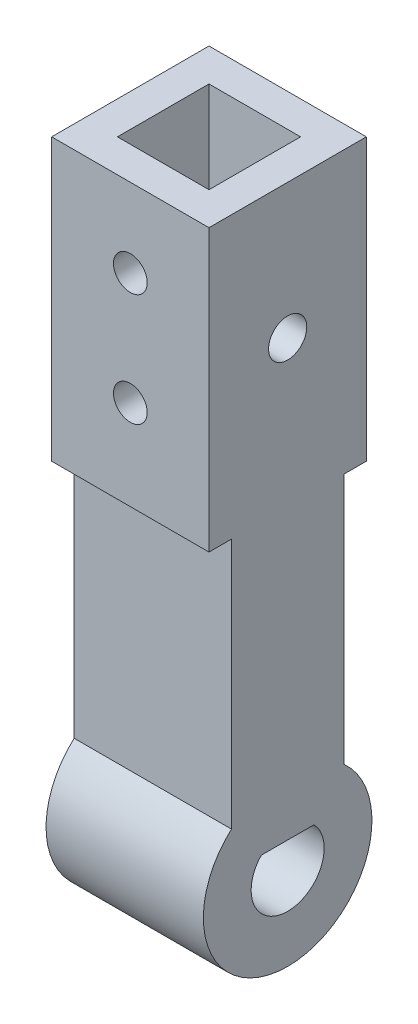
ISO-10303-21;
HEADER;
FILE_DESCRIPTION(('STEP AP214'),'2;1');
FILE_NAME('part.step','',(''),(''),'','','');
FILE_SCHEMA(('AUTOMOTIVE_DESIGN { 1 0 10303 214 1 1 1 1 }'));
ENDSEC;
DATA;
#1=APPLICATION_CONTEXT('core data for automotive mechanical design processes');
#2=APPLICATION_PROTOCOL_DEFINITION('international standard','automotive_design',2000,#1);
#3=PRODUCT_CONTEXT('',#1,'mechanical');
#4=PRODUCT('Part','Part','',(#3));
#5=PRODUCT_RELATED_PRODUCT_CATEGORY('part','',(#4));
#6=PRODUCT_DEFINITION_FORMATION('','',#4);
#7=PRODUCT_DEFINITION_CONTEXT('part definition',#1,'design');
#8=PRODUCT_DEFINITION('design','',#6,#7);
#9=PRODUCT_DEFINITION_SHAPE('','',#8);
#10=(LENGTH_UNIT() NAMED_UNIT(*) SI_UNIT(.MILLI.,.METRE.));
#11=(NAMED_UNIT(*) PLANE_ANGLE_UNIT() SI_UNIT($,.RADIAN.));
#12=(NAMED_UNIT(*) SI_UNIT($,.STERADIAN.) SOLID_ANGLE_UNIT());
#13=UNCERTAINTY_MEASURE_WITH_UNIT(LENGTH_MEASURE(1.E-05),#10,'distance_accuracy_value','');
#14=(GEOMETRIC_REPRESENTATION_CONTEXT(3) GLOBAL_UNCERTAINTY_ASSIGNED_CONTEXT((#13)) GLOBAL_UNIT_ASSIGNED_CONTEXT((#10,
#11,#12)) REPRESENTATION_CONTEXT('',''));
#15=CARTESIAN_POINT('',(0.,0.,0.));
#16=DIRECTION('',(0.,0.,1.));
#17=DIRECTION('',(1.,0.,0.));
#18=AXIS2_PLACEMENT_3D('',#15,#16,#17);
#19=CARTESIAN_POINT('',(0.,27.9408578006437,0.));
#20=DIRECTION('',(0.,1.,0.));
#21=DIRECTION('',(0.,0.,1.));
#22=AXIS2_PLACEMENT_3D('',#19,#20,#21);
#23=PLANE('',#22);
#24=DIRECTION('',(0.,0.,1.));
#25=VECTOR('',#24,1.);
#26=CARTESIAN_POINT('',(61.,27.9408578006437,-2.));
#27=LINE('',#26,#25);
#28=CARTESIAN_POINT('',(61.,27.9408578006437,10.));
#29=VERTEX_POINT('',#28);
#30=CARTESIAN_POINT('',(61.,27.9408578006437,12.));
#31=VERTEX_POINT('',#30);
#32=EDGE_CURVE('E256',#29,#31,#27,.T.);
#33=ORIENTED_EDGE('',*,*,#32,.F.);
#34=DIRECTION('',(1.,0.,0.));
#35=VECTOR('',#34,1.);
#36=CARTESIAN_POINT('',(65.,27.9408578006437,10.));
#37=LINE('',#36,#35);
#38=CARTESIAN_POINT('',(75.,27.9408578006437,10.));
#39=VERTEX_POINT('',#38);
#40=EDGE_CURVE('E59',#29,#39,#37,.T.);
#41=ORIENTED_EDGE('',*,*,#40,.T.);
#42=DIRECTION('',(0.,0.,-1.));
#43=VECTOR('',#42,1.);
#44=CARTESIAN_POINT('',(75.,27.9408578006437,-2.));
#45=LINE('',#44,#43);
#46=CARTESIAN_POINT('',(75.,27.9408578006437,12.));
#47=VERTEX_POINT('',#46);
#48=EDGE_CURVE('E289',#47,#39,#45,.T.);
#49=ORIENTED_EDGE('',*,*,#48,.F.);
#50=DIRECTION('',(1.,0.,0.));
#51=VECTOR('',#50,1.);
#52=CARTESIAN_POINT('',(61.,27.9408578006437,12.));
#53=LINE('',#52,#51);
#54=EDGE_CURVE('E285',#31,#47,#53,.T.);
#55=ORIENTED_EDGE('',*,*,#54,.F.);
#56=EDGE_LOOP('',(#33,#41,#49,#55));
#57=FACE_BOUND('',#56,.T.);
#58=ADVANCED_FACE('F41',(#57),#23,.F.);
#59=DIRECTION('',(-1.,0.,0.));
#60=VECTOR('',#59,1.);
#61=CARTESIAN_POINT('',(0.,27.9408578006437,0.));
#62=LINE('',#61,#60);
#63=CARTESIAN_POINT('',(75.,27.9408578006437,0.));
#64=VERTEX_POINT('',#63);
#65=CARTESIAN_POINT('',(61.,27.9408578006437,0.));
#66=VERTEX_POINT('',#65);
#67=EDGE_CURVE('E312',#64,#66,#62,.T.);
#68=ORIENTED_EDGE('',*,*,#67,.T.);
#69=CARTESIAN_POINT('',(61.,27.9408578006437,-2.));
#70=VERTEX_POINT('',#69);
#71=EDGE_CURVE('E281',#70,#66,#27,.T.);
#72=ORIENTED_EDGE('',*,*,#71,.F.);
#73=DIRECTION('',(-1.,0.,0.));
#74=VECTOR('',#73,1.);
#75=CARTESIAN_POINT('',(61.,27.9408578006437,-2.));
#76=LINE('',#75,#74);
#77=CARTESIAN_POINT('',(75.,27.9408578006437,-2.));
#78=VERTEX_POINT('',#77);
#79=EDGE_CURVE('E271',#78,#70,#76,.T.);
#80=ORIENTED_EDGE('',*,*,#79,.F.);
#81=EDGE_CURVE('E288',#64,#78,#45,.T.);
#82=ORIENTED_EDGE('',*,*,#81,.F.);
#83=EDGE_LOOP('',(#68,#72,#80,#82));
#84=FACE_BOUND('',#83,.T.);
#85=ADVANCED_FACE('F354',(#84),#23,.F.);
#86=CARTESIAN_POINT('',(0.,0.,0.));
#87=DIRECTION('',(0.,0.,-1.));
#88=DIRECTION('',(-1.,0.,0.));
#89=AXIS2_PLACEMENT_3D('',#86,#87,#88);
#90=PLANE('',#89);
#91=ORIENTED_EDGE('',*,*,#67,.F.);
#92=DIRECTION('',(0.,1.,0.));
#93=VECTOR('',#92,1.);
#94=CARTESIAN_POINT('',(75.,121.945008564838,0.));
#95=LINE('',#94,#93);
#96=CARTESIAN_POINT('',(75.,5.59016994374946,0.));
#97=VERTEX_POINT('',#96);
#98=EDGE_CURVE('E323',#97,#64,#95,.T.);
#99=ORIENTED_EDGE('',*,*,#98,.F.);
#100=DIRECTION('',(-1.,0.,0.));
#101=VECTOR('',#100,1.);
#102=CARTESIAN_POINT('',(96.2132034355964,5.59016994374946,0.));
#103=LINE('',#102,#101);
#104=CARTESIAN_POINT('',(61.,5.59016994374946,0.));
#105=VERTEX_POINT('',#104);
#106=EDGE_CURVE('E319',#105,#97,#103,.F.);
#107=ORIENTED_EDGE('',*,*,#106,.F.);
#108=DIRECTION('',(0.,-1.,0.));
#109=VECTOR('',#108,1.);
#110=CARTESIAN_POINT('',(61.,27.9408578006437,0.));
#111=LINE('',#110,#109);
#112=EDGE_CURVE('E173',#66,#105,#111,.T.);
#113=ORIENTED_EDGE('',*,*,#112,.F.);
#114=EDGE_LOOP('',(#91,#99,#107,#113));
#115=FACE_BOUND('',#114,.T.);
#116=ADVANCED_FACE('F360',(#115),#90,.T.);
#117=CARTESIAN_POINT('',(75.,121.945008564838,10.));
#118=DIRECTION('',(-1.,0.,0.));
#119=DIRECTION('',(0.,-1.,0.));
#120=AXIS2_PLACEMENT_3D('',#117,#118,#119);
#121=PLANE('',#120);
#122=CARTESIAN_POINT('',(75.,40.9408578006437,5.));
#123=DIRECTION('',(1.,0.,0.));
#124=DIRECTION('',(0.,0.,-1.));
#125=AXIS2_PLACEMENT_3D('',#122,#123,#124);
#126=CIRCLE('',#125,1.69999999999999);
#127=CARTESIAN_POINT('',(75.,40.9408578006437,3.30000000000001));
#128=VERTEX_POINT('',#127);
#129=EDGE_CURVE('E177',#128,#128,#126,.T.);
#130=ORIENTED_EDGE('',*,*,#129,.F.);
#131=EDGE_LOOP('',(#130));
#132=FACE_BOUND('',#131,.T.);
#133=DIRECTION('',(0.,0.,-1.));
#134=VECTOR('',#133,1.);
#135=CARTESIAN_POINT('',(75.,2.24999999999999,10.));
#136=LINE('',#135,#134);
#137=CARTESIAN_POINT('',(75.,2.24999999999998,7.34520787991172));
#138=VERTEX_POINT('',#137);
#139=CARTESIAN_POINT('',(75.,2.24999999999999,2.65479212008828));
#140=VERTEX_POINT('',#139);
#141=EDGE_CURVE('E154',#138,#140,#136,.T.);
#142=ORIENTED_EDGE('',*,*,#141,.T.);
#143=CARTESIAN_POINT('',(75.,0.,5.));
#144=DIRECTION('',(-1.,0.,0.));
#145=DIRECTION('',(0.,-1.,0.));
#146=AXIS2_PLACEMENT_3D('',#143,#144,#145);
#147=CIRCLE('',#146,3.25);
#148=EDGE_CURVE('E151',#140,#138,#147,.T.);
#149=ORIENTED_EDGE('',*,*,#148,.T.);
#150=EDGE_LOOP('',(#142,#149));
#151=FACE_BOUND('',#150,.T.);
#152=ORIENTED_EDGE('',*,*,#98,.T.);
#153=ORIENTED_EDGE('',*,*,#81,.T.);
#154=DIRECTION('',(0.,-1.,0.));
#155=VECTOR('',#154,1.);
#156=CARTESIAN_POINT('',(75.,52.9408578006437,-2.));
#157=LINE('',#156,#155);
#158=CARTESIAN_POINT('',(75.,52.9408578006437,-2.));
#159=VERTEX_POINT('',#158);
#160=EDGE_CURVE('E298',#159,#78,#157,.T.);
#161=ORIENTED_EDGE('',*,*,#160,.F.);
#162=DIRECTION('',(0.,0.,-1.));
#163=VECTOR('',#162,1.);
#164=CARTESIAN_POINT('',(75.,52.9408578006437,-2.));
#165=LINE('',#164,#163);
#166=CARTESIAN_POINT('',(75.,52.9408578006437,12.));
#167=VERTEX_POINT('',#166);
#168=EDGE_CURVE('E274',#167,#159,#165,.T.);
#169=ORIENTED_EDGE('',*,*,#168,.F.);
#170=DIRECTION('',(0.,-1.,0.));
#171=VECTOR('',#170,1.);
#172=CARTESIAN_POINT('',(75.,52.9408578006437,12.));
#173=LINE('',#172,#171);
#174=EDGE_CURVE('E302',#167,#47,#173,.T.);
#175=ORIENTED_EDGE('',*,*,#174,.T.);
#176=ORIENTED_EDGE('',*,*,#48,.T.);
#177=DIRECTION('',(0.,1.,0.));
#178=VECTOR('',#177,1.);
#179=CARTESIAN_POINT('',(75.,121.945008564838,10.));
#180=LINE('',#179,#178);
#181=CARTESIAN_POINT('',(75.,5.59016994374946,10.));
#182=VERTEX_POINT('',#181);
#183=EDGE_CURVE('E51',#182,#39,#180,.T.);
#184=ORIENTED_EDGE('',*,*,#183,.F.);
#185=CARTESIAN_POINT('',(75.,0.,5.));
#186=DIRECTION('',(-1.,0.,0.));
#187=DIRECTION('',(0.,-1.,0.));
#188=AXIS2_PLACEMENT_3D('',#185,#186,#187);
#189=CIRCLE('',#188,7.5);
#190=EDGE_CURVE('E315',#182,#97,#189,.F.);
#191=ORIENTED_EDGE('',*,*,#190,.T.);
#192=EDGE_LOOP('',(#152,#153,#161,#169,#175,#176,#184,#191));
#193=FACE_BOUND('',#192,.T.);
#194=ADVANCED_FACE('F43',(#132,#151,#193),#121,.F.);
#195=CARTESIAN_POINT('',(0.,0.,10.));
#196=DIRECTION('',(0.,0.,-1.));
#197=DIRECTION('',(-1.,0.,0.));
#198=AXIS2_PLACEMENT_3D('',#195,#196,#197);
#199=PLANE('',#198);
#200=ORIENTED_EDGE('',*,*,#183,.T.);
#201=ORIENTED_EDGE('',*,*,#40,.F.);
#202=DIRECTION('',(0.,1.,0.));
#203=VECTOR('',#202,1.);
#204=CARTESIAN_POINT('',(61.,5.59016994374946,10.));
#205=LINE('',#204,#203);
#206=CARTESIAN_POINT('',(61.,5.59016994374946,10.));
#207=VERTEX_POINT('',#206);
#208=EDGE_CURVE('E170',#207,#29,#205,.T.);
#209=ORIENTED_EDGE('',*,*,#208,.F.);
#210=DIRECTION('',(-1.,0.,0.));
#211=VECTOR('',#210,1.);
#212=CARTESIAN_POINT('',(96.2132034355964,5.59016994374946,10.));
#213=LINE('',#212,#211);
#214=EDGE_CURVE('E11',#207,#182,#213,.F.);
#215=ORIENTED_EDGE('',*,*,#214,.T.);
#216=EDGE_LOOP('',(#200,#201,#209,#215));
#217=FACE_BOUND('',#216,.T.);
#218=ADVANCED_FACE('F381',(#217),#199,.F.);
#219=CARTESIAN_POINT('',(96.2132034355964,0.,5.));
#220=DIRECTION('',(-1.,0.,0.));
#221=DIRECTION('',(0.,0.,1.));
#222=AXIS2_PLACEMENT_3D('',#219,#220,#221);
#223=CYLINDRICAL_SURFACE('',#222,7.5);
#224=ORIENTED_EDGE('',*,*,#214,.F.);
#225=CARTESIAN_POINT('',(61.,0.,5.));
#226=DIRECTION('',(-1.,0.,0.));
#227=DIRECTION('',(0.,-1.,0.));
#228=AXIS2_PLACEMENT_3D('',#225,#226,#227);
#229=CIRCLE('',#228,7.5);
#230=EDGE_CURVE('E161',#105,#207,#229,.T.);
#231=ORIENTED_EDGE('',*,*,#230,.F.);
#232=ORIENTED_EDGE('',*,*,#106,.T.);
#233=ORIENTED_EDGE('',*,*,#190,.F.);
#234=EDGE_LOOP('',(#224,#231,#232,#233));
#235=FACE_BOUND('',#234,.T.);
#236=ADVANCED_FACE('F377',(#235),#223,.T.);
#237=CARTESIAN_POINT('',(61.,52.9408578006437,-2.));
#238=DIRECTION('',(1.,0.,0.));
#239=DIRECTION('',(0.,0.,-1.));
#240=AXIS2_PLACEMENT_3D('',#237,#238,#239);
#241=PLANE('',#240);
#242=CARTESIAN_POINT('',(61.,40.9408578006437,5.));
#243=DIRECTION('',(-1.,0.,0.));
#244=DIRECTION('',(0.,0.,1.));
#245=AXIS2_PLACEMENT_3D('',#242,#243,#244);
#246=CIRCLE('',#245,1.5);
#247=CARTESIAN_POINT('',(61.,40.9408578006437,6.5));
#248=VERTEX_POINT('',#247);
#249=EDGE_CURVE('E213',#248,#248,#246,.T.);
#250=ORIENTED_EDGE('',*,*,#249,.F.);
#251=EDGE_LOOP('',(#250));
#252=FACE_BOUND('',#251,.T.);
#253=ORIENTED_EDGE('',*,*,#71,.T.);
#254=ORIENTED_EDGE('',*,*,#112,.T.);
#255=ORIENTED_EDGE('',*,*,#230,.T.);
#256=ORIENTED_EDGE('',*,*,#208,.T.);
#257=ORIENTED_EDGE('',*,*,#32,.T.);
#258=DIRECTION('',(0.,-1.,0.));
#259=VECTOR('',#258,1.);
#260=CARTESIAN_POINT('',(61.,52.9408578006437,12.));
#261=LINE('',#260,#259);
#262=CARTESIAN_POINT('',(61.,52.9408578006437,12.));
#263=VERTEX_POINT('',#262);
#264=EDGE_CURVE('E306',#263,#31,#261,.T.);
#265=ORIENTED_EDGE('',*,*,#264,.F.);
#266=DIRECTION('',(0.,0.,1.));
#267=VECTOR('',#266,1.);
#268=CARTESIAN_POINT('',(61.,52.9408578006437,-2.));
#269=LINE('',#268,#267);
#270=CARTESIAN_POINT('',(61.,52.9408578006437,-2.));
#271=VERTEX_POINT('',#270);
#272=EDGE_CURVE('E266',#271,#263,#269,.T.);
#273=ORIENTED_EDGE('',*,*,#272,.F.);
#274=DIRECTION('',(0.,-1.,0.));
#275=VECTOR('',#274,1.);
#276=CARTESIAN_POINT('',(61.,52.9408578006437,-2.));
#277=LINE('',#276,#275);
#278=EDGE_CURVE('E280',#271,#70,#277,.T.);
#279=ORIENTED_EDGE('',*,*,#278,.T.);
#280=EDGE_LOOP('',(#253,#254,#255,#256,#257,#265,#273,#279));
#281=FACE_BOUND('',#280,.T.);
#282=DIRECTION('',(0.,0.,-1.));
#283=VECTOR('',#282,1.);
#284=CARTESIAN_POINT('',(61.,2.24999999999998,7.34520787991171));
#285=LINE('',#284,#283);
#286=CARTESIAN_POINT('',(61.,2.24999999999998,7.34520787991171));
#287=VERTEX_POINT('',#286);
#288=CARTESIAN_POINT('',(61.,2.24999999999998,2.65479212008829));
#289=VERTEX_POINT('',#288);
#290=EDGE_CURVE('E157',#287,#289,#285,.T.);
#291=ORIENTED_EDGE('',*,*,#290,.F.);
#292=CARTESIAN_POINT('',(61.,0.,5.));
#293=DIRECTION('',(-1.,0.,0.));
#294=DIRECTION('',(0.,-1.,0.));
#295=AXIS2_PLACEMENT_3D('',#292,#293,#294);
#296=CIRCLE('',#295,3.25);
#297=EDGE_CURVE('E148',#289,#287,#296,.T.);
#298=ORIENTED_EDGE('',*,*,#297,.F.);
#299=EDGE_LOOP('',(#291,#298));
#300=FACE_BOUND('',#299,.T.);
#301=ADVANCED_FACE('F163',(#252,#281,#300),#241,.F.);
#302=CARTESIAN_POINT('',(61.,52.9408578006437,12.));
#303=DIRECTION('',(0.,0.,-1.));
#304=DIRECTION('',(-1.,0.,0.));
#305=AXIS2_PLACEMENT_3D('',#302,#303,#304);
#306=PLANE('',#305);
#307=CARTESIAN_POINT('',(68.,45.9408578006437,12.));
#308=DIRECTION('',(0.,0.,1.));
#309=DIRECTION('',(1.,0.,0.));
#310=AXIS2_PLACEMENT_3D('',#307,#308,#309);
#311=CIRCLE('',#310,1.5);
#312=CARTESIAN_POINT('',(69.5,45.9408578006437,12.));
#313=VERTEX_POINT('',#312);
#314=EDGE_CURVE('E198',#313,#313,#311,.T.);
#315=ORIENTED_EDGE('',*,*,#314,.F.);
#316=EDGE_LOOP('',(#315));
#317=FACE_BOUND('',#316,.T.);
#318=CARTESIAN_POINT('',(68.,35.9408578006437,12.));
#319=DIRECTION('',(0.,0.,1.));
#320=DIRECTION('',(1.,0.,0.));
#321=AXIS2_PLACEMENT_3D('',#318,#319,#320);
#322=CIRCLE('',#321,1.5);
#323=CARTESIAN_POINT('',(69.5,35.9408578006437,12.));
#324=VERTEX_POINT('',#323);
#325=EDGE_CURVE('E197',#324,#324,#322,.T.);
#326=ORIENTED_EDGE('',*,*,#325,.F.);
#327=EDGE_LOOP('',(#326));
#328=FACE_BOUND('',#327,.T.);
#329=ORIENTED_EDGE('',*,*,#54,.T.);
#330=ORIENTED_EDGE('',*,*,#174,.F.);
#331=DIRECTION('',(1.,0.,0.));
#332=VECTOR('',#331,1.);
#333=CARTESIAN_POINT('',(61.,52.9408578006437,12.));
#334=LINE('',#333,#332);
#335=EDGE_CURVE('E270',#263,#167,#334,.T.);
#336=ORIENTED_EDGE('',*,*,#335,.F.);
#337=ORIENTED_EDGE('',*,*,#264,.T.);
#338=EDGE_LOOP('',(#329,#330,#336,#337));
#339=FACE_BOUND('',#338,.T.);
#340=ADVANCED_FACE('F370',(#317,#328,#339),#306,.F.);
#341=CARTESIAN_POINT('',(61.,52.9408578006437,-2.));
#342=DIRECTION('',(0.,0.,1.));
#343=DIRECTION('',(1.,0.,0.));
#344=AXIS2_PLACEMENT_3D('',#341,#342,#343);
#345=PLANE('',#344);
#346=CARTESIAN_POINT('',(68.,45.9408578006437,-2.));
#347=DIRECTION('',(0.,0.,-1.));
#348=DIRECTION('',(-1.,0.,0.));
#349=AXIS2_PLACEMENT_3D('',#346,#347,#348);
#350=CIRCLE('',#349,1.69999999999999);
#351=CARTESIAN_POINT('',(66.3,45.9408578006437,-2.));
#352=VERTEX_POINT('',#351);
#353=EDGE_CURVE('E185',#352,#352,#350,.T.);
#354=ORIENTED_EDGE('',*,*,#353,.F.);
#355=EDGE_LOOP('',(#354));
#356=FACE_BOUND('',#355,.T.);
#357=CARTESIAN_POINT('',(68.,35.9408578006437,-2.));
#358=DIRECTION('',(0.,0.,-1.));
#359=DIRECTION('',(-1.,0.,0.));
#360=AXIS2_PLACEMENT_3D('',#357,#358,#359);
#361=CIRCLE('',#360,1.69999999999999);
#362=CARTESIAN_POINT('',(66.3,35.9408578006437,-2.));
#363=VERTEX_POINT('',#362);
#364=EDGE_CURVE('E189',#363,#363,#361,.T.);
#365=ORIENTED_EDGE('',*,*,#364,.F.);
#366=EDGE_LOOP('',(#365));
#367=FACE_BOUND('',#366,.T.);
#368=ORIENTED_EDGE('',*,*,#79,.T.);
#369=ORIENTED_EDGE('',*,*,#278,.F.);
#370=DIRECTION('',(-1.,0.,0.));
#371=VECTOR('',#370,1.);
#372=CARTESIAN_POINT('',(61.,52.9408578006437,-2.));
#373=LINE('',#372,#371);
#374=EDGE_CURVE('E277',#159,#271,#373,.T.);
#375=ORIENTED_EDGE('',*,*,#374,.F.);
#376=ORIENTED_EDGE('',*,*,#160,.T.);
#377=EDGE_LOOP('',(#368,#369,#375,#376));
#378=FACE_BOUND('',#377,.T.);
#379=ADVANCED_FACE('F367',(#356,#367,#378),#345,.F.);
#380=CARTESIAN_POINT('',(0.,52.9408578006437,0.));
#381=DIRECTION('',(0.,1.,0.));
#382=DIRECTION('',(0.,0.,1.));
#383=AXIS2_PLACEMENT_3D('',#380,#381,#382);
#384=PLANE('',#383);
#385=DIRECTION('',(0.,0.,1.));
#386=VECTOR('',#385,1.);
#387=CARTESIAN_POINT('',(63.925,52.9408578006437,0.925));
#388=LINE('',#387,#386);
#389=CARTESIAN_POINT('',(63.925,52.9408578006437,0.925));
#390=VERTEX_POINT('',#389);
#391=CARTESIAN_POINT('',(63.925,52.9408578006437,9.075));
#392=VERTEX_POINT('',#391);
#393=EDGE_CURVE('E221',#390,#392,#388,.T.);
#394=ORIENTED_EDGE('',*,*,#393,.F.);
#395=DIRECTION('',(-1.,0.,0.));
#396=VECTOR('',#395,1.);
#397=CARTESIAN_POINT('',(63.925,52.9408578006437,0.925));
#398=LINE('',#397,#396);
#399=CARTESIAN_POINT('',(72.075,52.9408578006437,0.924999999999999));
#400=VERTEX_POINT('',#399);
#401=EDGE_CURVE('E227',#400,#390,#398,.T.);
#402=ORIENTED_EDGE('',*,*,#401,.F.);
#403=DIRECTION('',(0.,0.,-1.));
#404=VECTOR('',#403,1.);
#405=CARTESIAN_POINT('',(72.075,52.9408578006437,0.924999999999999));
#406=LINE('',#405,#404);
#407=CARTESIAN_POINT('',(72.075,52.9408578006437,9.075));
#408=VERTEX_POINT('',#407);
#409=EDGE_CURVE('E246',#408,#400,#406,.T.);
#410=ORIENTED_EDGE('',*,*,#409,.F.);
#411=DIRECTION('',(1.,0.,0.));
#412=VECTOR('',#411,1.);
#413=CARTESIAN_POINT('',(63.925,52.9408578006437,9.075));
#414=LINE('',#413,#412);
#415=EDGE_CURVE('E242',#392,#408,#414,.T.);
#416=ORIENTED_EDGE('',*,*,#415,.F.);
#417=EDGE_LOOP('',(#394,#402,#410,#416));
#418=FACE_BOUND('',#417,.T.);
#419=ORIENTED_EDGE('',*,*,#272,.T.);
#420=ORIENTED_EDGE('',*,*,#335,.T.);
#421=ORIENTED_EDGE('',*,*,#168,.T.);
#422=ORIENTED_EDGE('',*,*,#374,.T.);
#423=EDGE_LOOP('',(#419,#420,#421,#422));
#424=FACE_BOUND('',#423,.T.);
#425=ADVANCED_FACE('F365',(#418,#424),#384,.T.);
#426=CARTESIAN_POINT('',(63.925,32.9408578006437,0.925));
#427=DIRECTION('',(-1.,0.,0.));
#428=DIRECTION('',(0.,0.,1.));
#429=AXIS2_PLACEMENT_3D('',#426,#427,#428);
#430=PLANE('',#429);
#431=CARTESIAN_POINT('',(63.925,40.9408578006437,5.));
#432=DIRECTION('',(-1.,0.,0.));
#433=DIRECTION('',(0.,0.,1.));
#434=AXIS2_PLACEMENT_3D('',#431,#432,#433);
#435=CIRCLE('',#434,1.5);
#436=CARTESIAN_POINT('',(63.925,40.9408578006437,6.5));
#437=VERTEX_POINT('',#436);
#438=EDGE_CURVE('E217',#437,#437,#435,.T.);
#439=ORIENTED_EDGE('',*,*,#438,.T.);
#440=EDGE_LOOP('',(#439));
#441=FACE_BOUND('',#440,.T.);
#442=ORIENTED_EDGE('',*,*,#393,.T.);
#443=DIRECTION('',(0.,1.,0.));
#444=VECTOR('',#443,1.);
#445=CARTESIAN_POINT('',(63.925,32.9408578006437,9.075));
#446=LINE('',#445,#444);
#447=CARTESIAN_POINT('',(63.925,32.9408578006437,9.075));
#448=VERTEX_POINT('',#447);
#449=EDGE_CURVE('E239',#448,#392,#446,.T.);
#450=ORIENTED_EDGE('',*,*,#449,.F.);
#451=DIRECTION('',(0.,0.,1.));
#452=VECTOR('',#451,1.);
#453=CARTESIAN_POINT('',(63.925,32.9408578006437,0.925));
#454=LINE('',#453,#452);
#455=CARTESIAN_POINT('',(63.925,32.9408578006437,0.925));
#456=VERTEX_POINT('',#455);
#457=EDGE_CURVE('E222',#456,#448,#454,.T.);
#458=ORIENTED_EDGE('',*,*,#457,.F.);
#459=DIRECTION('',(0.,1.,0.));
#460=VECTOR('',#459,1.);
#461=CARTESIAN_POINT('',(63.925,32.9408578006437,0.925));
#462=LINE('',#461,#460);
#463=EDGE_CURVE('E253',#456,#390,#462,.T.);
#464=ORIENTED_EDGE('',*,*,#463,.T.);
#465=EDGE_LOOP('',(#442,#450,#458,#464));
#466=FACE_BOUND('',#465,.T.);
#467=ADVANCED_FACE('F413',(#441,#466),#430,.F.);
#468=CARTESIAN_POINT('',(63.925,32.9408578006437,0.925));
#469=DIRECTION('',(0.,0.,-1.));
#470=DIRECTION('',(-1.,0.,0.));
#471=AXIS2_PLACEMENT_3D('',#468,#469,#470);
#472=PLANE('',#471);
#473=CARTESIAN_POINT('',(68.,45.9408578006437,0.925));
#474=DIRECTION('',(0.,0.,-1.));
#475=DIRECTION('',(-1.,0.,0.));
#476=AXIS2_PLACEMENT_3D('',#473,#474,#475);
#477=CIRCLE('',#476,1.69999999999999);
#478=CARTESIAN_POINT('',(66.3,45.9408578006437,0.925));
#479=VERTEX_POINT('',#478);
#480=EDGE_CURVE('E45',#479,#479,#477,.T.);
#481=ORIENTED_EDGE('',*,*,#480,.T.);
#482=EDGE_LOOP('',(#481));
#483=FACE_BOUND('',#482,.T.);
#484=CARTESIAN_POINT('',(68.,35.9408578006437,0.925));
#485=DIRECTION('',(0.,0.,-1.));
#486=DIRECTION('',(-1.,0.,0.));
#487=AXIS2_PLACEMENT_3D('',#484,#485,#486);
#488=CIRCLE('',#487,1.69999999999999);
#489=CARTESIAN_POINT('',(66.3,35.9408578006437,0.925));
#490=VERTEX_POINT('',#489);
#491=EDGE_CURVE('E193',#490,#490,#488,.T.);
#492=ORIENTED_EDGE('',*,*,#491,.T.);
#493=EDGE_LOOP('',(#492));
#494=FACE_BOUND('',#493,.T.);
#495=ORIENTED_EDGE('',*,*,#401,.T.);
#496=ORIENTED_EDGE('',*,*,#463,.F.);
#497=DIRECTION('',(-1.,0.,0.));
#498=VECTOR('',#497,1.);
#499=CARTESIAN_POINT('',(63.925,32.9408578006437,0.925));
#500=LINE('',#499,#498);
#501=CARTESIAN_POINT('',(72.075,32.9408578006437,0.924999999999999));
#502=VERTEX_POINT('',#501);
#503=EDGE_CURVE('E235',#502,#456,#500,.T.);
#504=ORIENTED_EDGE('',*,*,#503,.F.);
#505=DIRECTION('',(0.,1.,0.));
#506=VECTOR('',#505,1.);
#507=CARTESIAN_POINT('',(72.075,32.9408578006437,0.924999999999999));
#508=LINE('',#507,#506);
#509=EDGE_CURVE('E257',#502,#400,#508,.T.);
#510=ORIENTED_EDGE('',*,*,#509,.T.);
#511=EDGE_LOOP('',(#495,#496,#504,#510));
#512=FACE_BOUND('',#511,.T.);
#513=ADVANCED_FACE('F418',(#483,#494,#512),#472,.F.);
#514=CARTESIAN_POINT('',(72.075,32.9408578006437,0.924999999999999));
#515=DIRECTION('',(1.,0.,0.));
#516=DIRECTION('',(0.,0.,-1.));
#517=AXIS2_PLACEMENT_3D('',#514,#515,#516);
#518=PLANE('',#517);
#519=CARTESIAN_POINT('',(72.075,40.9408578006437,5.));
#520=DIRECTION('',(1.,0.,0.));
#521=DIRECTION('',(0.,0.,-1.));
#522=AXIS2_PLACEMENT_3D('',#519,#520,#521);
#523=CIRCLE('',#522,1.69999999999999);
#524=CARTESIAN_POINT('',(72.075,40.9408578006437,3.30000000000001));
#525=VERTEX_POINT('',#524);
#526=EDGE_CURVE('E181',#525,#525,#523,.T.);
#527=ORIENTED_EDGE('',*,*,#526,.T.);
#528=EDGE_LOOP('',(#527));
#529=FACE_BOUND('',#528,.T.);
#530=ORIENTED_EDGE('',*,*,#409,.T.);
#531=ORIENTED_EDGE('',*,*,#509,.F.);
#532=DIRECTION('',(0.,0.,-1.));
#533=VECTOR('',#532,1.);
#534=CARTESIAN_POINT('',(72.075,32.9408578006437,0.924999999999999));
#535=LINE('',#534,#533);
#536=CARTESIAN_POINT('',(72.075,32.9408578006437,9.075));
#537=VERTEX_POINT('',#536);
#538=EDGE_CURVE('E231',#537,#502,#535,.T.);
#539=ORIENTED_EDGE('',*,*,#538,.F.);
#540=DIRECTION('',(0.,1.,0.));
#541=VECTOR('',#540,1.);
#542=CARTESIAN_POINT('',(72.075,32.9408578006437,9.075));
#543=LINE('',#542,#541);
#544=EDGE_CURVE('E260',#537,#408,#543,.T.);
#545=ORIENTED_EDGE('',*,*,#544,.T.);
#546=EDGE_LOOP('',(#530,#531,#539,#545));
#547=FACE_BOUND('',#546,.T.);
#548=ADVANCED_FACE('F434',(#529,#547),#518,.F.);
#549=CARTESIAN_POINT('',(63.925,32.9408578006437,9.075));
#550=DIRECTION('',(0.,0.,1.));
#551=DIRECTION('',(1.,0.,0.));
#552=AXIS2_PLACEMENT_3D('',#549,#550,#551);
#553=PLANE('',#552);
#554=CARTESIAN_POINT('',(68.,45.9408578006437,9.075));
#555=DIRECTION('',(0.,0.,1.));
#556=DIRECTION('',(1.,0.,0.));
#557=AXIS2_PLACEMENT_3D('',#554,#555,#556);
#558=CIRCLE('',#557,1.5);
#559=CARTESIAN_POINT('',(69.5,45.9408578006437,9.075));
#560=VERTEX_POINT('',#559);
#561=EDGE_CURVE('E208',#560,#560,#558,.T.);
#562=ORIENTED_EDGE('',*,*,#561,.T.);
#563=EDGE_LOOP('',(#562));
#564=FACE_BOUND('',#563,.T.);
#565=CARTESIAN_POINT('',(68.,35.9408578006437,9.075));
#566=DIRECTION('',(0.,0.,1.));
#567=DIRECTION('',(1.,0.,0.));
#568=AXIS2_PLACEMENT_3D('',#565,#566,#567);
#569=CIRCLE('',#568,1.5);
#570=CARTESIAN_POINT('',(69.5,35.9408578006437,9.075));
#571=VERTEX_POINT('',#570);
#572=EDGE_CURVE('E202',#571,#571,#569,.T.);
#573=ORIENTED_EDGE('',*,*,#572,.T.);
#574=EDGE_LOOP('',(#573));
#575=FACE_BOUND('',#574,.T.);
#576=ORIENTED_EDGE('',*,*,#415,.T.);
#577=ORIENTED_EDGE('',*,*,#544,.F.);
#578=DIRECTION('',(1.,0.,0.));
#579=VECTOR('',#578,1.);
#580=CARTESIAN_POINT('',(63.925,32.9408578006437,9.075));
#581=LINE('',#580,#579);
#582=EDGE_CURVE('E226',#448,#537,#581,.T.);
#583=ORIENTED_EDGE('',*,*,#582,.F.);
#584=ORIENTED_EDGE('',*,*,#449,.T.);
#585=EDGE_LOOP('',(#576,#577,#583,#584));
#586=FACE_BOUND('',#585,.T.);
#587=ADVANCED_FACE('F335',(#564,#575,#586),#553,.F.);
#588=CARTESIAN_POINT('',(0.,32.9408578006437,0.));
#589=DIRECTION('',(0.,1.,0.));
#590=DIRECTION('',(0.,0.,1.));
#591=AXIS2_PLACEMENT_3D('',#588,#589,#590);
#592=PLANE('',#591);
#593=ORIENTED_EDGE('',*,*,#457,.T.);
#594=ORIENTED_EDGE('',*,*,#582,.T.);
#595=ORIENTED_EDGE('',*,*,#538,.T.);
#596=ORIENTED_EDGE('',*,*,#503,.T.);
#597=EDGE_LOOP('',(#593,#594,#595,#596));
#598=FACE_BOUND('',#597,.T.);
#599=ADVANCED_FACE('F430',(#598),#592,.T.);
#600=CARTESIAN_POINT('',(79.2426406871193,40.9408578006437,5.));
#601=DIRECTION('',(-1.,0.,0.));
#602=DIRECTION('',(0.,0.,1.));
#603=AXIS2_PLACEMENT_3D('',#600,#601,#602);
#604=CYLINDRICAL_SURFACE('',#603,1.5);
#605=ORIENTED_EDGE('',*,*,#249,.T.);
#606=EDGE_LOOP('',(#605));
#607=FACE_BOUND('',#606,.T.);
#608=ORIENTED_EDGE('',*,*,#438,.F.);
#609=EDGE_LOOP('',(#608));
#610=FACE_BOUND('',#609,.T.);
#611=ADVANCED_FACE('F448',(#607,#610),#604,.F.);
#612=CARTESIAN_POINT('',(85.,0.,5.));
#613=DIRECTION('',(-1.,0.,0.));
#614=DIRECTION('',(0.,0.,1.));
#615=AXIS2_PLACEMENT_3D('',#612,#613,#614);
#616=CYLINDRICAL_SURFACE('',#615,3.25);
#617=DIRECTION('',(-1.,0.,0.));
#618=VECTOR('',#617,1.);
#619=CARTESIAN_POINT('',(85.,2.24999999999998,2.65479212008829));
#620=LINE('',#619,#618);
#621=EDGE_CURVE('E67',#140,#289,#620,.T.);
#622=ORIENTED_EDGE('',*,*,#621,.T.);
#623=ORIENTED_EDGE('',*,*,#297,.T.);
#624=DIRECTION('',(-1.,0.,0.));
#625=VECTOR('',#624,1.);
#626=CARTESIAN_POINT('',(85.,2.24999999999998,7.34520787991172));
#627=LINE('',#626,#625);
#628=EDGE_CURVE('E155',#138,#287,#627,.T.);
#629=ORIENTED_EDGE('',*,*,#628,.F.);
#630=ORIENTED_EDGE('',*,*,#148,.F.);
#631=EDGE_LOOP('',(#622,#623,#629,#630));
#632=FACE_BOUND('',#631,.T.);
#633=ADVANCED_FACE('F145',(#632),#616,.F.);
#634=CARTESIAN_POINT('',(85.,2.24999999999998,2.65479212008829));
#635=DIRECTION('',(0.,1.,0.));
#636=DIRECTION('',(0.,0.,1.));
#637=AXIS2_PLACEMENT_3D('',#634,#635,#636);
#638=PLANE('',#637);
#639=ORIENTED_EDGE('',*,*,#628,.T.);
#640=ORIENTED_EDGE('',*,*,#290,.T.);
#641=ORIENTED_EDGE('',*,*,#621,.F.);
#642=ORIENTED_EDGE('',*,*,#141,.F.);
#643=EDGE_LOOP('',(#639,#640,#641,#642));
#644=FACE_BOUND('',#643,.T.);
#645=ADVANCED_FACE('F158',(#644),#638,.F.);
#646=CARTESIAN_POINT('',(68.,35.9408578006437,-6.24264068711928));
#647=DIRECTION('',(0.,0.,1.));
#648=DIRECTION('',(1.,0.,0.));
#649=AXIS2_PLACEMENT_3D('',#646,#647,#648);
#650=CYLINDRICAL_SURFACE('',#649,1.5);
#651=ORIENTED_EDGE('',*,*,#325,.T.);
#652=EDGE_LOOP('',(#651));
#653=FACE_BOUND('',#652,.T.);
#654=ORIENTED_EDGE('',*,*,#572,.F.);
#655=EDGE_LOOP('',(#654));
#656=FACE_BOUND('',#655,.T.);
#657=ADVANCED_FACE('F341',(#653,#656),#650,.F.);
#658=CARTESIAN_POINT('',(68.,45.9408578006437,-6.24264068711928));
#659=DIRECTION('',(0.,0.,1.));
#660=DIRECTION('',(1.,0.,0.));
#661=AXIS2_PLACEMENT_3D('',#658,#659,#660);
#662=CYLINDRICAL_SURFACE('',#661,1.5);
#663=ORIENTED_EDGE('',*,*,#314,.T.);
#664=EDGE_LOOP('',(#663));
#665=FACE_BOUND('',#664,.T.);
#666=ORIENTED_EDGE('',*,*,#561,.F.);
#667=EDGE_LOOP('',(#666));
#668=FACE_BOUND('',#667,.T.);
#669=ADVANCED_FACE('F338',(#665,#668),#662,.F.);
#670=CARTESIAN_POINT('',(68.,35.9408578006437,-2.));
#671=DIRECTION('',(0.,0.,-1.));
#672=DIRECTION('',(-1.,0.,0.));
#673=AXIS2_PLACEMENT_3D('',#670,#671,#672);
#674=CYLINDRICAL_SURFACE('',#673,1.69999999999999);
#675=ORIENTED_EDGE('',*,*,#364,.T.);
#676=EDGE_LOOP('',(#675));
#677=FACE_BOUND('',#676,.T.);
#678=ORIENTED_EDGE('',*,*,#491,.F.);
#679=EDGE_LOOP('',(#678));
#680=FACE_BOUND('',#679,.T.);
#681=ADVANCED_FACE('F340',(#677,#680),#674,.F.);
#682=CARTESIAN_POINT('',(68.,45.9408578006437,-2.));
#683=DIRECTION('',(0.,0.,-1.));
#684=DIRECTION('',(-1.,0.,0.));
#685=AXIS2_PLACEMENT_3D('',#682,#683,#684);
#686=CYLINDRICAL_SURFACE('',#685,1.69999999999999);
#687=ORIENTED_EDGE('',*,*,#353,.T.);
#688=EDGE_LOOP('',(#687));
#689=FACE_BOUND('',#688,.T.);
#690=ORIENTED_EDGE('',*,*,#480,.F.);
#691=EDGE_LOOP('',(#690));
#692=FACE_BOUND('',#691,.T.);
#693=ADVANCED_FACE('F348',(#689,#692),#686,.F.);
#694=CARTESIAN_POINT('',(75.,40.9408578006437,5.));
#695=DIRECTION('',(1.,0.,0.));
#696=DIRECTION('',(0.,0.,-1.));
#697=AXIS2_PLACEMENT_3D('',#694,#695,#696);
#698=CYLINDRICAL_SURFACE('',#697,1.69999999999999);
#699=ORIENTED_EDGE('',*,*,#129,.T.);
#700=EDGE_LOOP('',(#699));
#701=FACE_BOUND('',#700,.T.);
#702=ORIENTED_EDGE('',*,*,#526,.F.);
#703=EDGE_LOOP('',(#702));
#704=FACE_BOUND('',#703,.T.);
#705=ADVANCED_FACE('F503',(#701,#704),#698,.F.);
#706=CLOSED_SHELL('',(#58,#85,#116,#194,#218,#236,#301,#340,#379,#425,#467,#513,#548,#587,#599,
#611,#633,#645,#657,#669,#681,#693,#705));
#707=MANIFOLD_SOLID_BREP('B2',#706);
#708=ADVANCED_BREP_SHAPE_REPRESENTATION('',(#18,#707),#14);
#709=SHAPE_DEFINITION_REPRESENTATION(#9,#708);
ENDSEC;
END-ISO-10303-21;
